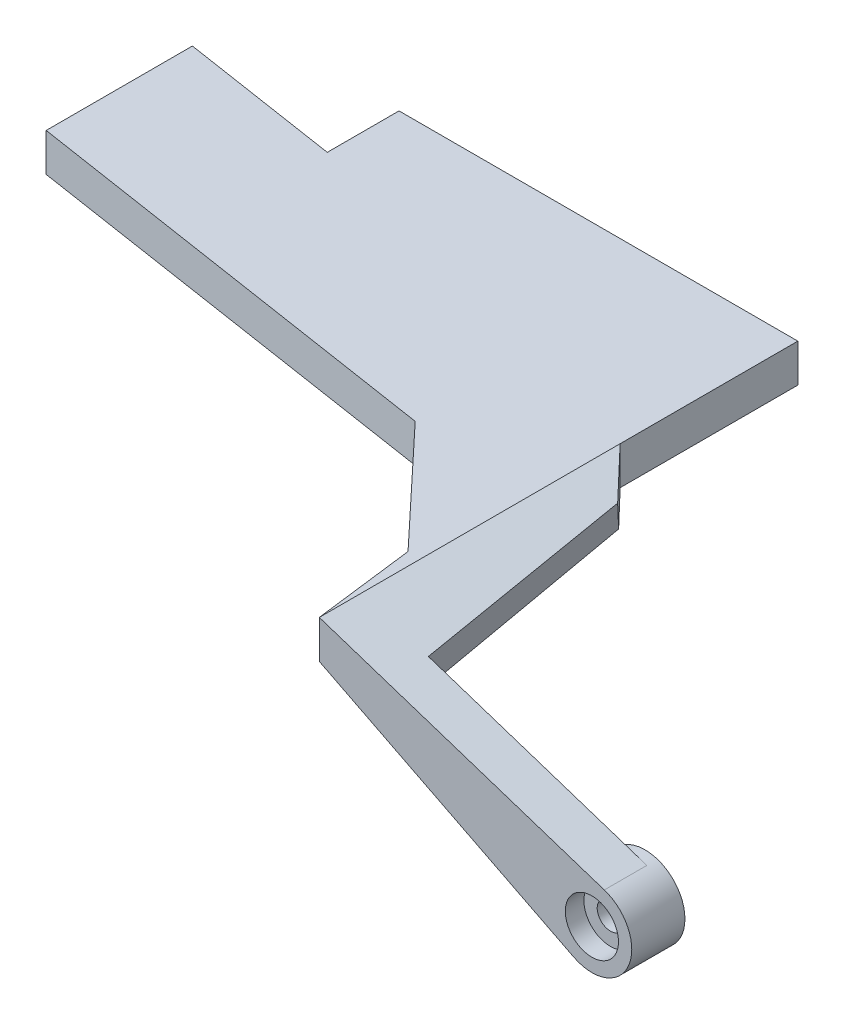
ISO-10303-21;
HEADER;
FILE_DESCRIPTION(('STEP AP214'),'2;1');
FILE_NAME('part.step','',(''),(''),'','','');
FILE_SCHEMA(('AUTOMOTIVE_DESIGN { 1 0 10303 214 1 1 1 1 }'));
ENDSEC;
DATA;
#1=APPLICATION_CONTEXT('core data for automotive mechanical design processes');
#2=APPLICATION_PROTOCOL_DEFINITION('international standard','automotive_design',2000,#1);
#3=PRODUCT_CONTEXT('',#1,'mechanical');
#4=PRODUCT('Part','Part','',(#3));
#5=PRODUCT_RELATED_PRODUCT_CATEGORY('part','',(#4));
#6=PRODUCT_DEFINITION_FORMATION('','',#4);
#7=PRODUCT_DEFINITION_CONTEXT('part definition',#1,'design');
#8=PRODUCT_DEFINITION('design','',#6,#7);
#9=PRODUCT_DEFINITION_SHAPE('','',#8);
#10=(LENGTH_UNIT() NAMED_UNIT(*) SI_UNIT(.MILLI.,.METRE.));
#11=(NAMED_UNIT(*) PLANE_ANGLE_UNIT() SI_UNIT($,.RADIAN.));
#12=(NAMED_UNIT(*) SI_UNIT($,.STERADIAN.) SOLID_ANGLE_UNIT());
#13=UNCERTAINTY_MEASURE_WITH_UNIT(LENGTH_MEASURE(1.E-05),#10,'distance_accuracy_value','');
#14=(GEOMETRIC_REPRESENTATION_CONTEXT(3) GLOBAL_UNCERTAINTY_ASSIGNED_CONTEXT((#13)) GLOBAL_UNIT_ASSIGNED_CONTEXT((#10,
#11,#12)) REPRESENTATION_CONTEXT('',''));
#15=CARTESIAN_POINT('',(0.,0.,0.));
#16=DIRECTION('',(0.,0.,1.));
#17=DIRECTION('',(1.,0.,0.));
#18=AXIS2_PLACEMENT_3D('',#15,#16,#17);
#19=CARTESIAN_POINT('',(-136.963719940332,-24.7170529321885,-103.861539430969));
#20=DIRECTION('',(0.,-1.,0.));
#21=DIRECTION('',(0.,0.,-1.));
#22=AXIS2_PLACEMENT_3D('',#19,#20,#21);
#23=PLANE('',#22);
#24=DIRECTION('',(0.,0.,1.));
#25=VECTOR('',#24,1.);
#26=CARTESIAN_POINT('',(-41.2676026719527,-24.7170529321878,2.));
#27=LINE('',#26,#25);
#28=CARTESIAN_POINT('',(-41.2676026719527,-24.7170529321883,-46.5823410297636));
#29=VERTEX_POINT('',#28);
#30=CARTESIAN_POINT('',(-41.2676026719527,-24.7170529321883,10.));
#31=VERTEX_POINT('',#30);
#32=EDGE_CURVE('E226',#29,#31,#27,.T.);
#33=ORIENTED_EDGE('',*,*,#32,.F.);
#34=DIRECTION('',(0.,0.,-1.));
#35=VECTOR('',#34,1.);
#36=CARTESIAN_POINT('',(-41.2676026719527,-24.7170529321885,-80.));
#37=LINE('',#36,#35);
#38=CARTESIAN_POINT('',(-41.2676026719527,-24.7170529321885,-80.));
#39=VERTEX_POINT('',#38);
#40=EDGE_CURVE('E293',#29,#39,#37,.T.);
#41=ORIENTED_EDGE('',*,*,#40,.T.);
#42=DIRECTION('',(1.,0.,0.));
#43=VECTOR('',#42,1.);
#44=CARTESIAN_POINT('',(0.,-24.7170529321885,-80.));
#45=LINE('',#44,#43);
#46=CARTESIAN_POINT('',(-116.267602671953,-24.7170529321885,-80.));
#47=VERTEX_POINT('',#46);
#48=EDGE_CURVE('E302',#47,#39,#45,.T.);
#49=ORIENTED_EDGE('',*,*,#48,.F.);
#50=DIRECTION('',(0.,0.,1.));
#51=VECTOR('',#50,1.);
#52=CARTESIAN_POINT('',(-116.267602671953,-24.7170529321885,-80.));
#53=LINE('',#52,#51);
#54=CARTESIAN_POINT('',(-116.267602671953,-24.7170529321885,-66.5));
#55=VERTEX_POINT('',#54);
#56=EDGE_CURVE('E309',#47,#55,#53,.T.);
#57=ORIENTED_EDGE('',*,*,#56,.T.);
#58=DIRECTION('',(-0.988277380271317,0.,-0.152668987171799));
#59=VECTOR('',#58,1.);
#60=CARTESIAN_POINT('',(-146.267602671953,-24.7170529321885,-71.1343968875384));
#61=LINE('',#60,#59);
#62=CARTESIAN_POINT('',(-146.267602671953,-24.7170529321885,-71.1343968875384));
#63=VERTEX_POINT('',#62);
#64=EDGE_CURVE('E297',#55,#63,#61,.T.);
#65=ORIENTED_EDGE('',*,*,#64,.T.);
#66=DIRECTION('',(0.,0.,1.));
#67=VECTOR('',#66,1.);
#68=CARTESIAN_POINT('',(-146.267602671953,-24.7170529321885,-59.5));
#69=LINE('',#68,#67);
#70=CARTESIAN_POINT('',(-146.267602671953,-24.7170529321885,-43.6343968875384));
#71=VERTEX_POINT('',#70);
#72=EDGE_CURVE('E282',#63,#71,#69,.T.);
#73=ORIENTED_EDGE('',*,*,#72,.T.);
#74=DIRECTION('',(-0.988277380271317,0.,-0.152668987171799));
#75=VECTOR('',#74,1.);
#76=CARTESIAN_POINT('',(-46.0414001066673,-24.7170529321885,-28.1514635135934));
#77=LINE('',#76,#75);
#78=CARTESIAN_POINT('',(-64.1813932684448,-24.7170529321888,-30.9537277752237));
#79=VERTEX_POINT('',#78);
#80=EDGE_CURVE('E287',#79,#71,#77,.T.);
#81=ORIENTED_EDGE('',*,*,#80,.F.);
#82=DIRECTION('',(-0.684229729304494,0.,-0.729266533947567));
#83=VECTOR('',#82,1.);
#84=CARTESIAN_POINT('',(-43.65450138931,-24.7170529321885,-9.0757317567967));
#85=LINE('',#84,#83);
#86=CARTESIAN_POINT('',(-43.65450138931,-24.7170529321885,-9.07573175679664));
#87=VERTEX_POINT('',#86);
#88=EDGE_CURVE('E328',#87,#79,#85,.T.);
#89=ORIENTED_EDGE('',*,*,#88,.F.);
#90=DIRECTION('',(-0.124159305403862,0.,-0.992262297420209));
#91=VECTOR('',#90,1.);
#92=CARTESIAN_POINT('',(-41.2676026719527,-24.7170529321885,10.));
#93=LINE('',#92,#91);
#94=EDGE_CURVE('E294',#31,#87,#93,.T.);
#95=ORIENTED_EDGE('',*,*,#94,.F.);
#96=EDGE_LOOP('',(#33,#41,#49,#57,#65,#73,#81,#89,#95));
#97=FACE_BOUND('',#96,.T.);
#98=ADVANCED_FACE('F53',(#97),#23,.F.);
#99=CARTESIAN_POINT('',(-34.1535189881641,-24.7170529321884,-39.));
#100=DIRECTION('',(0.729266533947567,0.,-0.684229729304494));
#101=DIRECTION('',(-0.684229729304494,0.,-0.729266533947567));
#102=AXIS2_PLACEMENT_3D('',#99,#100,#101);
#103=PLANE('',#102);
#104=DIRECTION('',(0.337895834039163,0.869556255589418,0.360136534809076));
#105=VECTOR('',#104,1.);
#106=CARTESIAN_POINT('',(-33.4675974793439,-25.2863719546207,-38.2689303316215));
#107=LINE('',#106,#105);
#108=CARTESIAN_POINT('',(-36.8926768928071,-34.1006245432522,-41.9194524959983));
#109=VERTEX_POINT('',#108);
#110=CARTESIAN_POINT('',(-34.153518988164,-27.0515530511382,-39.));
#111=VERTEX_POINT('',#110);
#112=EDGE_CURVE('E150',#109,#111,#107,.T.);
#113=ORIENTED_EDGE('',*,*,#112,.F.);
#114=DIRECTION('',(0.646538879477251,-0.327316047887424,0.689094828103983));
#115=VECTOR('',#114,1.);
#116=CARTESIAN_POINT('',(-36.4327562087551,-34.3334634728573,-41.4292592921889));
#117=LINE('',#116,#115);
#118=CARTESIAN_POINT('',(-41.2676026719527,-31.8857795257514,-46.5823410297637));
#119=VERTEX_POINT('',#118);
#120=EDGE_CURVE('E161',#119,#109,#117,.T.);
#121=ORIENTED_EDGE('',*,*,#120,.F.);
#122=DIRECTION('',(0.,-1.,0.));
#123=VECTOR('',#122,1.);
#124=CARTESIAN_POINT('',(-41.2676026719528,-24.7170529321885,-46.5823410297637));
#125=LINE('',#124,#123);
#126=EDGE_CURVE('E167',#29,#119,#125,.T.);
#127=ORIENTED_EDGE('',*,*,#126,.F.);
#128=DIRECTION('',(0.667608146166301,-0.219076885500874,0.711550898679519));
#129=VECTOR('',#128,1.);
#130=CARTESIAN_POINT('',(-34.4949571705869,-26.9395094608586,-39.3639120447251));
#131=LINE('',#130,#129);
#132=EDGE_CURVE('E12',#29,#111,#131,.T.);
#133=ORIENTED_EDGE('',*,*,#132,.T.);
#134=EDGE_LOOP('',(#113,#121,#127,#133));
#135=FACE_BOUND('',#134,.T.);
#136=ADVANCED_FACE('F165',(#135),#103,.T.);
#137=CARTESIAN_POINT('',(-41.2676026719526,-31.8857795257514,-80.));
#138=DIRECTION('',(0.,-1.,0.));
#139=DIRECTION('',(-1.,0.,0.));
#140=AXIS2_PLACEMENT_3D('',#137,#138,#139);
#141=PLANE('',#140);
#142=DIRECTION('',(0.,0.,1.));
#143=VECTOR('',#142,1.);
#144=CARTESIAN_POINT('',(-41.2676026719526,-31.8857795257514,-80.));
#145=LINE('',#144,#143);
#146=CARTESIAN_POINT('',(-41.2676026719526,-31.8857795257514,-80.));
#147=VERTEX_POINT('',#146);
#148=EDGE_CURVE('E230',#147,#119,#145,.T.);
#149=ORIENTED_EDGE('',*,*,#148,.T.);
#150=DIRECTION('',(0.,0.,1.));
#151=VECTOR('',#150,1.);
#152=CARTESIAN_POINT('',(-41.2676026719526,-31.8857795257514,2.));
#153=LINE('',#152,#151);
#154=CARTESIAN_POINT('',(-41.2676026719526,-31.8857795257514,10.));
#155=VERTEX_POINT('',#154);
#156=EDGE_CURVE('E225',#119,#155,#153,.T.);
#157=ORIENTED_EDGE('',*,*,#156,.T.);
#158=DIRECTION('',(-0.124159305403862,0.,-0.992262297420209));
#159=VECTOR('',#158,1.);
#160=CARTESIAN_POINT('',(-41.2676026719526,-31.8857795257514,10.));
#161=LINE('',#160,#159);
#162=CARTESIAN_POINT('',(-43.6545013893099,-31.8857795257515,-9.0757317567967));
#163=VERTEX_POINT('',#162);
#164=EDGE_CURVE('E318',#155,#163,#161,.T.);
#165=ORIENTED_EDGE('',*,*,#164,.T.);
#166=DIRECTION('',(-0.684229729304494,0.,-0.729266533947567));
#167=VECTOR('',#166,1.);
#168=CARTESIAN_POINT('',(-43.6545013893099,-31.8857795257515,-9.0757317567967));
#169=LINE('',#168,#167);
#170=CARTESIAN_POINT('',(-64.1813932684447,-31.8857795257518,-30.9537277752237));
#171=VERTEX_POINT('',#170);
#172=EDGE_CURVE('E325',#163,#171,#169,.T.);
#173=ORIENTED_EDGE('',*,*,#172,.T.);
#174=DIRECTION('',(-0.988277380271317,0.,-0.152668987171799));
#175=VECTOR('',#174,1.);
#176=CARTESIAN_POINT('',(-46.0414001066672,-31.8857795257515,-28.1514635135934));
#177=LINE('',#176,#175);
#178=CARTESIAN_POINT('',(-146.267602671953,-31.8857795257527,-43.6343968875384));
#179=VERTEX_POINT('',#178);
#180=EDGE_CURVE('E69',#171,#179,#177,.T.);
#181=ORIENTED_EDGE('',*,*,#180,.T.);
#182=DIRECTION('',(0.,0.,-1.));
#183=VECTOR('',#182,1.);
#184=CARTESIAN_POINT('',(-146.267602671953,-31.8857795257527,-59.5));
#185=LINE('',#184,#183);
#186=CARTESIAN_POINT('',(-146.267602671953,-31.8857795257527,-71.1343968875384));
#187=VERTEX_POINT('',#186);
#188=EDGE_CURVE('E285',#179,#187,#185,.T.);
#189=ORIENTED_EDGE('',*,*,#188,.T.);
#190=DIRECTION('',(0.988277380271317,0.,0.152668987171799));
#191=VECTOR('',#190,1.);
#192=CARTESIAN_POINT('',(-146.267602671953,-31.8857795257527,-71.1343968875384));
#193=LINE('',#192,#191);
#194=CARTESIAN_POINT('',(-116.267602671953,-31.8857795257525,-66.5));
#195=VERTEX_POINT('',#194);
#196=EDGE_CURVE('E312',#187,#195,#193,.T.);
#197=ORIENTED_EDGE('',*,*,#196,.T.);
#198=DIRECTION('',(0.,0.,1.));
#199=VECTOR('',#198,1.);
#200=CARTESIAN_POINT('',(-116.267602671953,-31.8857795257525,-80.));
#201=LINE('',#200,#199);
#202=CARTESIAN_POINT('',(-116.267602671953,-31.8857795257525,-80.));
#203=VERTEX_POINT('',#202);
#204=EDGE_CURVE('E199',#203,#195,#201,.T.);
#205=ORIENTED_EDGE('',*,*,#204,.F.);
#206=DIRECTION('',(-1.,0.,0.));
#207=VECTOR('',#206,1.);
#208=CARTESIAN_POINT('',(-41.2676026719526,-31.8857795257514,-80.));
#209=LINE('',#208,#207);
#210=EDGE_CURVE('E235',#147,#203,#209,.T.);
#211=ORIENTED_EDGE('',*,*,#210,.F.);
#212=EDGE_LOOP('',(#149,#157,#165,#173,#181,#189,#197,#205,#211));
#213=FACE_BOUND('',#212,.T.);
#214=ADVANCED_FACE('F323',(#213),#141,.T.);
#215=CARTESIAN_POINT('',(-146.267602671953,-17.5483263386243,-59.5));
#216=DIRECTION('',(-1.,0.,0.));
#217=DIRECTION('',(0.,-1.,0.));
#218=AXIS2_PLACEMENT_3D('',#215,#216,#217);
#219=PLANE('',#218);
#220=ORIENTED_EDGE('',*,*,#72,.F.);
#221=DIRECTION('',(0.,-1.,0.));
#222=VECTOR('',#221,1.);
#223=CARTESIAN_POINT('',(-146.267602671953,-17.5483263386243,-71.1343968875384));
#224=LINE('',#223,#222);
#225=EDGE_CURVE('E229',#63,#187,#224,.T.);
#226=ORIENTED_EDGE('',*,*,#225,.T.);
#227=ORIENTED_EDGE('',*,*,#188,.F.);
#228=DIRECTION('',(0.,1.,0.));
#229=VECTOR('',#228,1.);
#230=CARTESIAN_POINT('',(-146.267602671953,-17.5483263386243,-43.6343968875384));
#231=LINE('',#230,#229);
#232=EDGE_CURVE('E62',#179,#71,#231,.T.);
#233=ORIENTED_EDGE('',*,*,#232,.T.);
#234=EDGE_LOOP('',(#220,#226,#227,#233));
#235=FACE_BOUND('',#234,.T.);
#236=ADVANCED_FACE('F280',(#235),#219,.T.);
#237=CARTESIAN_POINT('',(-41.2676026719527,-24.7170529321878,-80.));
#238=DIRECTION('',(1.,0.,0.));
#239=DIRECTION('',(0.,0.,-1.));
#240=AXIS2_PLACEMENT_3D('',#237,#238,#239);
#241=PLANE('',#240);
#242=ORIENTED_EDGE('',*,*,#126,.T.);
#243=ORIENTED_EDGE('',*,*,#148,.F.);
#244=DIRECTION('',(0.,1.,0.));
#245=VECTOR('',#244,1.);
#246=CARTESIAN_POINT('',(-41.2676026719527,-24.7170529321878,-80.));
#247=LINE('',#246,#245);
#248=EDGE_CURVE('E267',#147,#39,#247,.T.);
#249=ORIENTED_EDGE('',*,*,#248,.T.);
#250=ORIENTED_EDGE('',*,*,#40,.F.);
#251=EDGE_LOOP('',(#242,#243,#249,#250));
#252=FACE_BOUND('',#251,.T.);
#253=ADVANCED_FACE('F408',(#252),#241,.T.);
#254=CARTESIAN_POINT('',(-116.267602671953,-17.5483263386241,-80.));
#255=DIRECTION('',(-1.,0.,0.));
#256=DIRECTION('',(0.,0.,1.));
#257=AXIS2_PLACEMENT_3D('',#254,#255,#256);
#258=PLANE('',#257);
#259=ORIENTED_EDGE('',*,*,#56,.F.);
#260=DIRECTION('',(0.,-1.,0.));
#261=VECTOR('',#260,1.);
#262=CARTESIAN_POINT('',(-116.267602671953,-17.5483263386241,-80.));
#263=LINE('',#262,#261);
#264=EDGE_CURVE('E273',#47,#203,#263,.T.);
#265=ORIENTED_EDGE('',*,*,#264,.T.);
#266=ORIENTED_EDGE('',*,*,#204,.T.);
#267=DIRECTION('',(0.,-1.,0.));
#268=VECTOR('',#267,1.);
#269=CARTESIAN_POINT('',(-116.267602671953,-17.5483263386241,-66.5));
#270=LINE('',#269,#268);
#271=EDGE_CURVE('E264',#55,#195,#270,.T.);
#272=ORIENTED_EDGE('',*,*,#271,.F.);
#273=EDGE_LOOP('',(#259,#265,#266,#272));
#274=FACE_BOUND('',#273,.T.);
#275=ADVANCED_FACE('F412',(#274),#258,.T.);
#276=CARTESIAN_POINT('',(0.,0.,-80.));
#277=DIRECTION('',(0.,0.,1.));
#278=DIRECTION('',(1.,0.,0.));
#279=AXIS2_PLACEMENT_3D('',#276,#277,#278);
#280=PLANE('',#279);
#281=ORIENTED_EDGE('',*,*,#264,.F.);
#282=ORIENTED_EDGE('',*,*,#48,.T.);
#283=ORIENTED_EDGE('',*,*,#248,.F.);
#284=ORIENTED_EDGE('',*,*,#210,.T.);
#285=EDGE_LOOP('',(#281,#282,#283,#284));
#286=FACE_BOUND('',#285,.T.);
#287=ADVANCED_FACE('F55',(#286),#280,.F.);
#288=CARTESIAN_POINT('',(-46.0414001066673,-24.7170529321883,-28.1514635135934));
#289=DIRECTION('',(0.152668987171799,0.,-0.988277380271317));
#290=DIRECTION('',(-0.988277380271317,0.,-0.152668987171799));
#291=AXIS2_PLACEMENT_3D('',#288,#289,#290);
#292=PLANE('',#291);
#293=ORIENTED_EDGE('',*,*,#180,.F.);
#294=DIRECTION('',(0.,-1.,0.));
#295=VECTOR('',#294,1.);
#296=CARTESIAN_POINT('',(-64.1813932684448,-24.7170529321888,-30.9537277752237));
#297=LINE('',#296,#295);
#298=EDGE_CURVE('E288',#79,#171,#297,.T.);
#299=ORIENTED_EDGE('',*,*,#298,.F.);
#300=ORIENTED_EDGE('',*,*,#80,.T.);
#301=ORIENTED_EDGE('',*,*,#232,.F.);
#302=EDGE_LOOP('',(#293,#299,#300,#301));
#303=FACE_BOUND('',#302,.T.);
#304=ADVANCED_FACE('F286',(#303),#292,.F.);
#305=CARTESIAN_POINT('',(-41.2676026719527,-24.7170529321883,10.));
#306=DIRECTION('',(0.992262297420209,0.,-0.124159305403862));
#307=DIRECTION('',(-0.124159305403862,0.,-0.992262297420209));
#308=AXIS2_PLACEMENT_3D('',#305,#306,#307);
#309=PLANE('',#308);
#310=ORIENTED_EDGE('',*,*,#94,.T.);
#311=DIRECTION('',(0.,-1.,0.));
#312=VECTOR('',#311,1.);
#313=CARTESIAN_POINT('',(-43.65450138931,-24.7170529321885,-9.0757317567967));
#314=LINE('',#313,#312);
#315=EDGE_CURVE('E77',#87,#163,#314,.T.);
#316=ORIENTED_EDGE('',*,*,#315,.T.);
#317=ORIENTED_EDGE('',*,*,#164,.F.);
#318=DIRECTION('',(0.,-1.,0.));
#319=VECTOR('',#318,1.);
#320=CARTESIAN_POINT('',(-41.2676026719527,-24.7170529321872,10.));
#321=LINE('',#320,#319);
#322=EDGE_CURVE('E177',#31,#155,#321,.T.);
#323=ORIENTED_EDGE('',*,*,#322,.F.);
#324=EDGE_LOOP('',(#310,#316,#317,#323));
#325=FACE_BOUND('',#324,.T.);
#326=ADVANCED_FACE('F341',(#325),#309,.F.);
#327=CARTESIAN_POINT('',(-146.267602671953,-17.5483263386243,-71.1343968875384));
#328=DIRECTION('',(0.152668987171799,0.,-0.988277380271317));
#329=DIRECTION('',(-0.988277380271317,0.,-0.152668987171799));
#330=AXIS2_PLACEMENT_3D('',#327,#328,#329);
#331=PLANE('',#330);
#332=ORIENTED_EDGE('',*,*,#64,.F.);
#333=ORIENTED_EDGE('',*,*,#271,.T.);
#334=ORIENTED_EDGE('',*,*,#196,.F.);
#335=ORIENTED_EDGE('',*,*,#225,.F.);
#336=EDGE_LOOP('',(#332,#333,#334,#335));
#337=FACE_BOUND('',#336,.T.);
#338=ADVANCED_FACE('F398',(#337),#331,.T.);
#339=CARTESIAN_POINT('',(10.0000000000004,-49.4341058643748,2.));
#340=DIRECTION('',(0.,0.,1.));
#341=DIRECTION('',(1.,0.,0.));
#342=AXIS2_PLACEMENT_3D('',#339,#340,#341);
#343=PLANE('',#342);
#344=CARTESIAN_POINT('',(10.0000000000004,-49.4341058643748,2.));
#345=DIRECTION('',(0.,0.,1.));
#346=DIRECTION('',(1.,0.,0.));
#347=AXIS2_PLACEMENT_3D('',#344,#345,#346);
#348=CIRCLE('',#347,7.5);
#349=CARTESIAN_POINT('',(12.3384512309939,-42.307981683569,2.));
#350=VERTEX_POINT('',#349);
#351=CARTESIAN_POINT('',(6.61243550204531,-56.1254739436389,2.));
#352=VERTEX_POINT('',#351);
#353=EDGE_CURVE('E221',#350,#352,#348,.T.);
#354=ORIENTED_EDGE('',*,*,#353,.T.);
#355=DIRECTION('',(-0.892182410568547,0.451675266394007,0.));
#356=VECTOR('',#355,1.);
#357=CARTESIAN_POINT('',(-41.2676026719526,-31.8857795257514,2.));
#358=LINE('',#357,#356);
#359=CARTESIAN_POINT('',(-31.3971453888908,-36.8827861579676,2.));
#360=VERTEX_POINT('',#359);
#361=EDGE_CURVE('E241',#352,#360,#358,.T.);
#362=ORIENTED_EDGE('',*,*,#361,.T.);
#363=DIRECTION('',(0.3117934974658,0.950149890774105,0.));
#364=VECTOR('',#363,1.);
#365=CARTESIAN_POINT('',(-45.5880572428182,-80.1277333989631,2.));
#366=LINE('',#365,#364);
#367=CARTESIAN_POINT('',(-28.7525984690317,-28.8238754126375,2.));
#368=VERTEX_POINT('',#367);
#369=EDGE_CURVE('E176',#360,#368,#366,.T.);
#370=ORIENTED_EDGE('',*,*,#369,.T.);
#371=DIRECTION('',(0.950149890774105,-0.3117934974658,0.));
#372=VECTOR('',#371,1.);
#373=CARTESIAN_POINT('',(-41.2676026719527,-24.7170529321878,2.));
#374=LINE('',#373,#372);
#375=EDGE_CURVE('E173',#368,#350,#374,.T.);
#376=ORIENTED_EDGE('',*,*,#375,.T.);
#377=EDGE_LOOP('',(#354,#362,#370,#376));
#378=FACE_BOUND('',#377,.T.);
#379=ADVANCED_FACE('F395',(#378),#343,.F.);
#380=CARTESIAN_POINT('',(-41.2676026719527,-24.7170529321878,2.));
#381=DIRECTION('',(0.3117934974658,0.950149890774105,0.));
#382=DIRECTION('',(0.950149890774105,-0.3117934974658,0.));
#383=AXIS2_PLACEMENT_3D('',#380,#381,#382);
#384=PLANE('',#383);
#385=DIRECTION('',(-0.130481720878272,0.042817825380001,-0.990525695954614));
#386=VECTOR('',#385,1.);
#387=CARTESIAN_POINT('',(-28.7525984690317,-28.8238754126375,2.));
#388=LINE('',#387,#386);
#389=EDGE_CURVE('E154',#368,#111,#388,.T.);
#390=ORIENTED_EDGE('',*,*,#389,.T.);
#391=ORIENTED_EDGE('',*,*,#132,.F.);
#392=ORIENTED_EDGE('',*,*,#32,.T.);
#393=DIRECTION('',(0.950149890774105,-0.3117934974658,0.));
#394=VECTOR('',#393,1.);
#395=CARTESIAN_POINT('',(-41.2676026719527,-24.7170529321878,10.));
#396=LINE('',#395,#394);
#397=CARTESIAN_POINT('',(12.3384512309939,-42.307981683569,10.));
#398=VERTEX_POINT('',#397);
#399=EDGE_CURVE('E204',#31,#398,#396,.T.);
#400=ORIENTED_EDGE('',*,*,#399,.T.);
#401=DIRECTION('',(0.,0.,1.));
#402=VECTOR('',#401,1.);
#403=CARTESIAN_POINT('',(12.3384512309939,-42.307981683569,2.));
#404=LINE('',#403,#402);
#405=EDGE_CURVE('E231',#350,#398,#404,.T.);
#406=ORIENTED_EDGE('',*,*,#405,.F.);
#407=ORIENTED_EDGE('',*,*,#375,.F.);
#408=EDGE_LOOP('',(#390,#391,#392,#400,#406,#407));
#409=FACE_BOUND('',#408,.T.);
#410=ADVANCED_FACE('F171',(#409),#384,.T.);
#411=CARTESIAN_POINT('',(10.0000000000004,-49.4341058643748,10.));
#412=DIRECTION('',(0.,0.,-1.));
#413=DIRECTION('',(-1.,0.,0.));
#414=AXIS2_PLACEMENT_3D('',#411,#412,#413);
#415=CYLINDRICAL_SURFACE('',#414,5.);
#416=CARTESIAN_POINT('',(10.0000000000004,-49.4341058643748,3.));
#417=DIRECTION('',(0.,0.,-1.));
#418=DIRECTION('',(1.,0.,0.));
#419=AXIS2_PLACEMENT_3D('',#416,#417,#418);
#420=CIRCLE('',#419,5.);
#421=CARTESIAN_POINT('',(15.0000000000004,-49.4341058643747,3.));
#422=VERTEX_POINT('',#421);
#423=EDGE_CURVE('E194',#422,#422,#420,.T.);
#424=ORIENTED_EDGE('',*,*,#423,.F.);
#425=EDGE_LOOP('',(#424));
#426=FACE_BOUND('',#425,.T.);
#427=CARTESIAN_POINT('',(10.0000000000004,-49.4341058643748,0.));
#428=DIRECTION('',(0.,0.,-1.));
#429=DIRECTION('',(1.,0.,0.));
#430=AXIS2_PLACEMENT_3D('',#427,#428,#429);
#431=CIRCLE('',#430,5.);
#432=CARTESIAN_POINT('',(15.0000000000004,-49.4341058643747,0.));
#433=VERTEX_POINT('',#432);
#434=EDGE_CURVE('E220',#433,#433,#431,.T.);
#435=ORIENTED_EDGE('',*,*,#434,.T.);
#436=EDGE_LOOP('',(#435));
#437=FACE_BOUND('',#436,.T.);
#438=ADVANCED_FACE('F366',(#426,#437),#415,.F.);
#439=CARTESIAN_POINT('',(10.0000000000004,-49.4341058643748,3.));
#440=DIRECTION('',(0.,0.,1.));
#441=DIRECTION('',(1.,0.,0.));
#442=AXIS2_PLACEMENT_3D('',#439,#440,#441);
#443=CYLINDRICAL_SURFACE('',#442,2.49999999999999);
#444=CARTESIAN_POINT('',(10.0000000000004,-49.4341058643748,3.));
#445=DIRECTION('',(0.,0.,-1.));
#446=DIRECTION('',(1.,0.,0.));
#447=AXIS2_PLACEMENT_3D('',#444,#445,#446);
#448=CIRCLE('',#447,2.49999999999999);
#449=CARTESIAN_POINT('',(12.5000000000004,-49.4341058643747,3.));
#450=VERTEX_POINT('',#449);
#451=EDGE_CURVE('E200',#450,#450,#448,.T.);
#452=ORIENTED_EDGE('',*,*,#451,.T.);
#453=EDGE_LOOP('',(#452));
#454=FACE_BOUND('',#453,.T.);
#455=CARTESIAN_POINT('',(10.0000000000004,-49.4341058643748,6.49999999999999));
#456=DIRECTION('',(0.,0.,-1.));
#457=DIRECTION('',(1.,0.,0.));
#458=AXIS2_PLACEMENT_3D('',#455,#456,#457);
#459=CIRCLE('',#458,2.49999999999999);
#460=CARTESIAN_POINT('',(12.5000000000004,-49.4341058643747,6.49999999999999));
#461=VERTEX_POINT('',#460);
#462=EDGE_CURVE('E188',#461,#461,#459,.F.);
#463=ORIENTED_EDGE('',*,*,#462,.T.);
#464=EDGE_LOOP('',(#463));
#465=FACE_BOUND('',#464,.T.);
#466=ADVANCED_FACE('F364',(#454,#465),#443,.F.);
#467=CARTESIAN_POINT('',(3.63599096777061E-13,-49.4341058643749,10.));
#468=DIRECTION('',(0.,0.,1.));
#469=DIRECTION('',(1.,0.,0.));
#470=AXIS2_PLACEMENT_3D('',#467,#468,#469);
#471=PLANE('',#470);
#472=ORIENTED_EDGE('',*,*,#322,.T.);
#473=DIRECTION('',(-0.892182410568547,0.451675266394007,0.));
#474=VECTOR('',#473,1.);
#475=CARTESIAN_POINT('',(-41.2676026719526,-31.8857795257514,10.));
#476=LINE('',#475,#474);
#477=CARTESIAN_POINT('',(6.61243550204531,-56.1254739436389,10.));
#478=VERTEX_POINT('',#477);
#479=EDGE_CURVE('E215',#478,#155,#476,.T.);
#480=ORIENTED_EDGE('',*,*,#479,.F.);
#481=CARTESIAN_POINT('',(10.0000000000004,-49.4341058643748,10.));
#482=DIRECTION('',(0.,0.,-1.));
#483=DIRECTION('',(1.,0.,0.));
#484=AXIS2_PLACEMENT_3D('',#481,#482,#483);
#485=CIRCLE('',#484,7.5);
#486=EDGE_CURVE('E198',#398,#478,#485,.T.);
#487=ORIENTED_EDGE('',*,*,#486,.F.);
#488=ORIENTED_EDGE('',*,*,#399,.F.);
#489=EDGE_LOOP('',(#472,#480,#487,#488));
#490=FACE_BOUND('',#489,.T.);
#491=CARTESIAN_POINT('',(10.0000000000004,-49.4341058643748,10.));
#492=DIRECTION('',(0.,0.,-1.));
#493=DIRECTION('',(1.,0.,0.));
#494=AXIS2_PLACEMENT_3D('',#491,#492,#493);
#495=CIRCLE('',#494,5.);
#496=CARTESIAN_POINT('',(15.0000000000004,-49.4341058643747,10.));
#497=VERTEX_POINT('',#496);
#498=EDGE_CURVE('E192',#497,#497,#495,.T.);
#499=ORIENTED_EDGE('',*,*,#498,.T.);
#500=EDGE_LOOP('',(#499));
#501=FACE_BOUND('',#500,.T.);
#502=ADVANCED_FACE('F360',(#490,#501),#471,.T.);
#503=CARTESIAN_POINT('',(10.0000000000004,-49.4341058643748,3.));
#504=DIRECTION('',(0.,0.,1.));
#505=DIRECTION('',(1.,0.,0.));
#506=AXIS2_PLACEMENT_3D('',#503,#504,#505);
#507=PLANE('',#506);
#508=ORIENTED_EDGE('',*,*,#451,.F.);
#509=EDGE_LOOP('',(#508));
#510=FACE_BOUND('',#509,.T.);
#511=ORIENTED_EDGE('',*,*,#423,.T.);
#512=EDGE_LOOP('',(#511));
#513=FACE_BOUND('',#512,.T.);
#514=ADVANCED_FACE('F363',(#510,#513),#507,.F.);
#515=CARTESIAN_POINT('',(10.0000000000004,-49.4341058643748,6.49999999999999));
#516=DIRECTION('',(0.,0.,1.));
#517=DIRECTION('',(1.,0.,0.));
#518=AXIS2_PLACEMENT_3D('',#515,#516,#517);
#519=PLANE('',#518);
#520=CARTESIAN_POINT('',(10.0000000000004,-49.4341058643748,6.49999999999999));
#521=DIRECTION('',(0.,0.,-1.));
#522=DIRECTION('',(1.,0.,0.));
#523=AXIS2_PLACEMENT_3D('',#520,#521,#522);
#524=CIRCLE('',#523,5.);
#525=CARTESIAN_POINT('',(15.0000000000004,-49.4341058643747,6.49999999999999));
#526=VERTEX_POINT('',#525);
#527=EDGE_CURVE('E193',#526,#526,#524,.T.);
#528=ORIENTED_EDGE('',*,*,#527,.F.);
#529=EDGE_LOOP('',(#528));
#530=FACE_BOUND('',#529,.T.);
#531=ORIENTED_EDGE('',*,*,#462,.F.);
#532=EDGE_LOOP('',(#531));
#533=FACE_BOUND('',#532,.T.);
#534=ADVANCED_FACE('F372',(#530,#533),#519,.T.);
#535=CARTESIAN_POINT('',(10.0000000000004,-49.4341058643748,6.49999999999999));
#536=DIRECTION('',(0.,0.,1.));
#537=DIRECTION('',(1.,0.,0.));
#538=AXIS2_PLACEMENT_3D('',#535,#536,#537);
#539=CYLINDRICAL_SURFACE('',#538,5.);
#540=ORIENTED_EDGE('',*,*,#527,.T.);
#541=EDGE_LOOP('',(#540));
#542=FACE_BOUND('',#541,.T.);
#543=ORIENTED_EDGE('',*,*,#498,.F.);
#544=EDGE_LOOP('',(#543));
#545=FACE_BOUND('',#544,.T.);
#546=ADVANCED_FACE('F377',(#542,#545),#539,.F.);
#547=CARTESIAN_POINT('',(10.0000000000004,-49.4341058643748,0.));
#548=DIRECTION('',(0.,0.,1.));
#549=DIRECTION('',(1.,0.,0.));
#550=AXIS2_PLACEMENT_3D('',#547,#548,#549);
#551=CYLINDRICAL_SURFACE('',#550,7.5);
#552=DIRECTION('',(0.,0.,1.));
#553=VECTOR('',#552,1.);
#554=CARTESIAN_POINT('',(6.61243550204531,-56.1254739436389,2.));
#555=LINE('',#554,#553);
#556=EDGE_CURVE('E208',#352,#478,#555,.T.);
#557=ORIENTED_EDGE('',*,*,#556,.F.);
#558=ORIENTED_EDGE('',*,*,#353,.F.);
#559=ORIENTED_EDGE('',*,*,#405,.T.);
#560=ORIENTED_EDGE('',*,*,#486,.T.);
#561=EDGE_LOOP('',(#557,#558,#559,#560));
#562=FACE_BOUND('',#561,.T.);
#563=CARTESIAN_POINT('',(10.0000000000004,-49.4341058643748,0.));
#564=DIRECTION('',(0.,0.,-1.));
#565=DIRECTION('',(1.,0.,0.));
#566=AXIS2_PLACEMENT_3D('',#563,#564,#565);
#567=CIRCLE('',#566,7.5);
#568=CARTESIAN_POINT('',(17.5000000000004,-49.4341058643747,0.));
#569=VERTEX_POINT('',#568);
#570=EDGE_CURVE('E216',#569,#569,#567,.T.);
#571=ORIENTED_EDGE('',*,*,#570,.F.);
#572=EDGE_LOOP('',(#571));
#573=FACE_BOUND('',#572,.T.);
#574=ADVANCED_FACE('F380',(#562,#573),#551,.T.);
#575=CARTESIAN_POINT('',(10.0000000000004,-49.4341058643748,0.));
#576=DIRECTION('',(0.,0.,1.));
#577=DIRECTION('',(1.,0.,0.));
#578=AXIS2_PLACEMENT_3D('',#575,#576,#577);
#579=PLANE('',#578);
#580=ORIENTED_EDGE('',*,*,#434,.F.);
#581=EDGE_LOOP('',(#580));
#582=FACE_BOUND('',#581,.T.);
#583=ORIENTED_EDGE('',*,*,#570,.T.);
#584=EDGE_LOOP('',(#583));
#585=FACE_BOUND('',#584,.T.);
#586=ADVANCED_FACE('F387',(#582,#585),#579,.F.);
#587=CARTESIAN_POINT('',(-41.2676026719526,-31.8857795257514,2.));
#588=DIRECTION('',(-0.451675266394007,-0.892182410568547,0.));
#589=DIRECTION('',(-0.892182410568547,0.451675266394007,0.));
#590=AXIS2_PLACEMENT_3D('',#587,#588,#589);
#591=PLANE('',#590);
#592=ORIENTED_EDGE('',*,*,#120,.T.);
#593=DIRECTION('',(0.123914754910579,-0.0627329448231527,0.990307887047895));
#594=VECTOR('',#593,1.);
#595=CARTESIAN_POINT('',(-31.5875493609699,-36.7863924566431,0.478320395248819));
#596=LINE('',#595,#594);
#597=EDGE_CURVE('E156',#109,#360,#596,.T.);
#598=ORIENTED_EDGE('',*,*,#597,.T.);
#599=ORIENTED_EDGE('',*,*,#361,.F.);
#600=ORIENTED_EDGE('',*,*,#556,.T.);
#601=ORIENTED_EDGE('',*,*,#479,.T.);
#602=ORIENTED_EDGE('',*,*,#156,.F.);
#603=EDGE_LOOP('',(#592,#598,#599,#600,#601,#602));
#604=FACE_BOUND('',#603,.T.);
#605=ADVANCED_FACE('F351',(#604),#591,.T.);
#606=CARTESIAN_POINT('',(-45.5880572428182,-80.1277333989631,2.));
#607=DIRECTION('',(-0.941147881820221,0.308839471071435,0.137327512369617));
#608=DIRECTION('',(0.3117934974658,0.950149890774105,0.));
#609=AXIS2_PLACEMENT_3D('',#606,#607,#608);
#610=PLANE('',#609);
#611=ORIENTED_EDGE('',*,*,#597,.F.);
#612=ORIENTED_EDGE('',*,*,#112,.T.);
#613=ORIENTED_EDGE('',*,*,#389,.F.);
#614=ORIENTED_EDGE('',*,*,#369,.F.);
#615=EDGE_LOOP('',(#611,#612,#613,#614));
#616=FACE_BOUND('',#615,.T.);
#617=ADVANCED_FACE('F151',(#616),#610,.F.);
#618=CARTESIAN_POINT('',(-43.65450138931,-24.7170529321885,-9.0757317567967));
#619=DIRECTION('',(-0.729266533947567,0.,0.684229729304495));
#620=DIRECTION('',(0.684229729304495,0.,0.729266533947567));
#621=AXIS2_PLACEMENT_3D('',#618,#619,#620);
#622=PLANE('',#621);
#623=ORIENTED_EDGE('',*,*,#172,.F.);
#624=ORIENTED_EDGE('',*,*,#315,.F.);
#625=ORIENTED_EDGE('',*,*,#88,.T.);
#626=ORIENTED_EDGE('',*,*,#298,.T.);
#627=EDGE_LOOP('',(#623,#624,#625,#626));
#628=FACE_BOUND('',#627,.T.);
#629=ADVANCED_FACE('F343',(#628),#622,.T.);
#630=CLOSED_SHELL('',(#98,#136,#214,#236,#253,#275,#287,#304,#326,#338,#379,#410,#438,#466,#502,
#514,#534,#546,#574,#586,#605,#617,#629));
#631=MANIFOLD_SOLID_BREP('B2',#630);
#632=ADVANCED_BREP_SHAPE_REPRESENTATION('',(#18,#631),#14);
#633=SHAPE_DEFINITION_REPRESENTATION(#9,#632);
ENDSEC;
END-ISO-10303-21;
